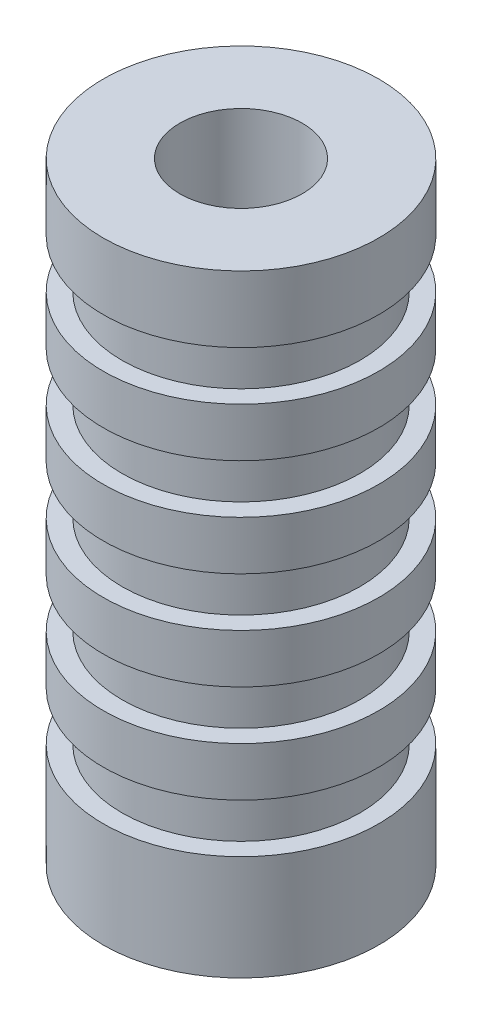
ISO-10303-21;
HEADER;
FILE_DESCRIPTION(('STEP AP214'),'2;1');
FILE_NAME('part.step','',(''),(''),'','','');
FILE_SCHEMA(('AUTOMOTIVE_DESIGN { 1 0 10303 214 1 1 1 1 }'));
ENDSEC;
DATA;
#1=APPLICATION_CONTEXT('core data for automotive mechanical design processes');
#2=APPLICATION_PROTOCOL_DEFINITION('international standard','automotive_design',2000,#1);
#3=PRODUCT_CONTEXT('',#1,'mechanical');
#4=PRODUCT('Part','Part','',(#3));
#5=PRODUCT_RELATED_PRODUCT_CATEGORY('part','',(#4));
#6=PRODUCT_DEFINITION_FORMATION('','',#4);
#7=PRODUCT_DEFINITION_CONTEXT('part definition',#1,'design');
#8=PRODUCT_DEFINITION('design','',#6,#7);
#9=PRODUCT_DEFINITION_SHAPE('','',#8);
#10=(LENGTH_UNIT() NAMED_UNIT(*) SI_UNIT(.MILLI.,.METRE.));
#11=(NAMED_UNIT(*) PLANE_ANGLE_UNIT() SI_UNIT($,.RADIAN.));
#12=(NAMED_UNIT(*) SI_UNIT($,.STERADIAN.) SOLID_ANGLE_UNIT());
#13=UNCERTAINTY_MEASURE_WITH_UNIT(LENGTH_MEASURE(1.E-05),#10,'distance_accuracy_value','');
#14=(GEOMETRIC_REPRESENTATION_CONTEXT(3) GLOBAL_UNCERTAINTY_ASSIGNED_CONTEXT((#13)) GLOBAL_UNIT_ASSIGNED_CONTEXT((#10,
#11,#12)) REPRESENTATION_CONTEXT('',''));
#15=CARTESIAN_POINT('',(0.,0.,0.));
#16=DIRECTION('',(0.,0.,1.));
#17=DIRECTION('',(1.,0.,0.));
#18=AXIS2_PLACEMENT_3D('',#15,#16,#17);
#19=CARTESIAN_POINT('',(0.,25.4,0.));
#20=DIRECTION('',(0.,-1.,0.));
#21=DIRECTION('',(0.,0.,-1.));
#22=AXIS2_PLACEMENT_3D('',#19,#20,#21);
#23=CYLINDRICAL_SURFACE('',#22,5.715);
#24=CARTESIAN_POINT('',(0.,8.42138588701736,0.));
#25=DIRECTION('',(0.,-1.,0.));
#26=DIRECTION('',(0.,0.,-1.));
#27=AXIS2_PLACEMENT_3D('',#24,#25,#26);
#28=CIRCLE('',#27,5.715);
#29=CARTESIAN_POINT('',(0.,8.42138588701736,-5.715));
#30=VERTEX_POINT('',#29);
#31=EDGE_CURVE('E62',#30,#30,#28,.T.);
#32=ORIENTED_EDGE('',*,*,#31,.T.);
#33=EDGE_LOOP('',(#32));
#34=FACE_BOUND('',#33,.T.);
#35=CARTESIAN_POINT('',(0.,6.38938588701736,0.));
#36=DIRECTION('',(0.,-1.,0.));
#37=DIRECTION('',(0.,0.,-1.));
#38=AXIS2_PLACEMENT_3D('',#35,#36,#37);
#39=CIRCLE('',#38,5.715);
#40=CARTESIAN_POINT('',(0.,6.38938588701736,-5.715));
#41=VERTEX_POINT('',#40);
#42=EDGE_CURVE('E53',#41,#41,#39,.T.);
#43=ORIENTED_EDGE('',*,*,#42,.F.);
#44=EDGE_LOOP('',(#43));
#45=FACE_BOUND('',#44,.T.);
#46=ADVANCED_FACE('F32',(#34,#45),#23,.T.);
#47=CARTESIAN_POINT('',(0.,4.35738588701736,0.));
#48=DIRECTION('',(0.,-1.,0.));
#49=DIRECTION('',(0.,0.,-1.));
#50=AXIS2_PLACEMENT_3D('',#47,#48,#49);
#51=CIRCLE('',#50,5.715);
#52=CARTESIAN_POINT('',(0.,4.35738588701736,-5.715));
#53=VERTEX_POINT('',#52);
#54=EDGE_CURVE('E48',#53,#53,#51,.T.);
#55=ORIENTED_EDGE('',*,*,#54,.T.);
#56=EDGE_LOOP('',(#55));
#57=FACE_BOUND('',#56,.T.);
#58=CARTESIAN_POINT('',(0.,0.,0.));
#59=DIRECTION('',(0.,1.,0.));
#60=DIRECTION('',(0.,0.,1.));
#61=AXIS2_PLACEMENT_3D('',#58,#59,#60);
#62=CIRCLE('',#61,5.715);
#63=CARTESIAN_POINT('',(0.,0.,5.715));
#64=VERTEX_POINT('',#63);
#65=EDGE_CURVE('E36',#64,#64,#62,.T.);
#66=ORIENTED_EDGE('',*,*,#65,.T.);
#67=EDGE_LOOP('',(#66));
#68=FACE_BOUND('',#67,.T.);
#69=ADVANCED_FACE('F175',(#57,#68),#23,.T.);
#70=CARTESIAN_POINT('',(0.,25.4,0.));
#71=DIRECTION('',(0.,1.,0.));
#72=DIRECTION('',(0.,0.,1.));
#73=AXIS2_PLACEMENT_3D('',#70,#71,#72);
#74=PLANE('',#73);
#75=CARTESIAN_POINT('',(0.,25.4,0.));
#76=DIRECTION('',(0.,1.,0.));
#77=DIRECTION('',(0.,0.,1.));
#78=AXIS2_PLACEMENT_3D('',#75,#76,#77);
#79=CIRCLE('',#78,5.715);
#80=CARTESIAN_POINT('',(0.,25.4,5.715));
#81=VERTEX_POINT('',#80);
#82=EDGE_CURVE('E10',#81,#81,#79,.T.);
#83=ORIENTED_EDGE('',*,*,#82,.T.);
#84=EDGE_LOOP('',(#83));
#85=FACE_BOUND('',#84,.T.);
#86=CARTESIAN_POINT('',(0.,25.4,0.));
#87=DIRECTION('',(0.,1.,0.));
#88=DIRECTION('',(0.,0.,1.));
#89=AXIS2_PLACEMENT_3D('',#86,#87,#88);
#90=CIRCLE('',#89,2.54);
#91=CARTESIAN_POINT('',(0.,25.4,2.54));
#92=VERTEX_POINT('',#91);
#93=EDGE_CURVE('E43',#92,#92,#90,.T.);
#94=ORIENTED_EDGE('',*,*,#93,.F.);
#95=EDGE_LOOP('',(#94));
#96=FACE_BOUND('',#95,.T.);
#97=ADVANCED_FACE('F207',(#85,#96),#74,.T.);
#98=CARTESIAN_POINT('',(0.,0.,0.));
#99=DIRECTION('',(0.,1.,0.));
#100=DIRECTION('',(0.,0.,1.));
#101=AXIS2_PLACEMENT_3D('',#98,#99,#100);
#102=PLANE('',#101);
#103=ORIENTED_EDGE('',*,*,#65,.F.);
#104=EDGE_LOOP('',(#103));
#105=FACE_BOUND('',#104,.T.);
#106=CARTESIAN_POINT('',(0.,0.,0.));
#107=DIRECTION('',(0.,1.,0.));
#108=DIRECTION('',(0.,0.,1.));
#109=AXIS2_PLACEMENT_3D('',#106,#107,#108);
#110=CIRCLE('',#109,2.54);
#111=CARTESIAN_POINT('',(0.,0.,2.54));
#112=VERTEX_POINT('',#111);
#113=EDGE_CURVE('E45',#112,#112,#110,.T.);
#114=ORIENTED_EDGE('',*,*,#113,.T.);
#115=EDGE_LOOP('',(#114));
#116=FACE_BOUND('',#115,.T.);
#117=ADVANCED_FACE('F199',(#105,#116),#102,.F.);
#118=CARTESIAN_POINT('',(0.,22.6453858870174,0.));
#119=DIRECTION('',(0.,-1.,0.));
#120=DIRECTION('',(0.,0.,-1.));
#121=AXIS2_PLACEMENT_3D('',#118,#119,#120);
#122=CIRCLE('',#121,5.715);
#123=CARTESIAN_POINT('',(0.,22.6453858870174,-5.715));
#124=VERTEX_POINT('',#123);
#125=EDGE_CURVE('E67',#124,#124,#122,.T.);
#126=ORIENTED_EDGE('',*,*,#125,.F.);
#127=EDGE_LOOP('',(#126));
#128=FACE_BOUND('',#127,.T.);
#129=ORIENTED_EDGE('',*,*,#82,.F.);
#130=EDGE_LOOP('',(#129));
#131=FACE_BOUND('',#130,.T.);
#132=ADVANCED_FACE('F34',(#128,#131),#23,.T.);
#133=CARTESIAN_POINT('',(0.,25.4,0.));
#134=DIRECTION('',(0.,-1.,0.));
#135=DIRECTION('',(0.,0.,-1.));
#136=AXIS2_PLACEMENT_3D('',#133,#134,#135);
#137=CYLINDRICAL_SURFACE('',#136,2.54);
#138=ORIENTED_EDGE('',*,*,#93,.T.);
#139=EDGE_LOOP('',(#138));
#140=FACE_BOUND('',#139,.T.);
#141=ORIENTED_EDGE('',*,*,#113,.F.);
#142=EDGE_LOOP('',(#141));
#143=FACE_BOUND('',#142,.T.);
#144=ADVANCED_FACE('F198',(#140,#143),#137,.F.);
#145=CARTESIAN_POINT('',(0.,4.35738588701736,-4.93518326354092));
#146=DIRECTION('',(0.,-1.,0.));
#147=DIRECTION('',(0.,0.,-1.));
#148=AXIS2_PLACEMENT_3D('',#145,#146,#147);
#149=PLANE('',#148);
#150=ORIENTED_EDGE('',*,*,#54,.F.);
#151=EDGE_LOOP('',(#150));
#152=FACE_BOUND('',#151,.T.);
#153=CARTESIAN_POINT('',(0.,4.35738588701736,0.));
#154=DIRECTION('',(0.,-1.,0.));
#155=DIRECTION('',(0.,0.,-1.));
#156=AXIS2_PLACEMENT_3D('',#153,#154,#155);
#157=CIRCLE('',#156,4.93518326354092);
#158=CARTESIAN_POINT('',(0.,4.35738588701736,-4.93518326354092));
#159=VERTEX_POINT('',#158);
#160=EDGE_CURVE('E59',#159,#159,#157,.T.);
#161=ORIENTED_EDGE('',*,*,#160,.T.);
#162=EDGE_LOOP('',(#161));
#163=FACE_BOUND('',#162,.T.);
#164=ADVANCED_FACE('F204',(#152,#163),#149,.F.);
#165=CARTESIAN_POINT('',(0.,6.38938588701736,-5.715));
#166=DIRECTION('',(0.,1.,0.));
#167=DIRECTION('',(0.,0.,1.));
#168=AXIS2_PLACEMENT_3D('',#165,#166,#167);
#169=PLANE('',#168);
#170=CARTESIAN_POINT('',(0.,6.38938588701736,0.));
#171=DIRECTION('',(0.,-1.,0.));
#172=DIRECTION('',(0.,0.,-1.));
#173=AXIS2_PLACEMENT_3D('',#170,#171,#172);
#174=CIRCLE('',#173,4.93518326354092);
#175=CARTESIAN_POINT('',(0.,6.38938588701736,-4.93518326354092));
#176=VERTEX_POINT('',#175);
#177=EDGE_CURVE('E56',#176,#176,#174,.T.);
#178=ORIENTED_EDGE('',*,*,#177,.F.);
#179=EDGE_LOOP('',(#178));
#180=FACE_BOUND('',#179,.T.);
#181=ORIENTED_EDGE('',*,*,#42,.T.);
#182=EDGE_LOOP('',(#181));
#183=FACE_BOUND('',#182,.T.);
#184=ADVANCED_FACE('F226',(#180,#183),#169,.F.);
#185=CARTESIAN_POINT('',(0.,0.,0.));
#186=DIRECTION('',(0.,-1.,0.));
#187=DIRECTION('',(0.,0.,-1.));
#188=AXIS2_PLACEMENT_3D('',#185,#186,#187);
#189=CYLINDRICAL_SURFACE('',#188,4.93518326354092);
#190=ORIENTED_EDGE('',*,*,#160,.F.);
#191=EDGE_LOOP('',(#190));
#192=FACE_BOUND('',#191,.T.);
#193=ORIENTED_EDGE('',*,*,#177,.T.);
#194=EDGE_LOOP('',(#193));
#195=FACE_BOUND('',#194,.T.);
#196=ADVANCED_FACE('F182',(#192,#195),#189,.T.);
#197=CARTESIAN_POINT('',(0.,20.6133858870174,-4.93518326354092));
#198=DIRECTION('',(0.,-1.,0.));
#199=DIRECTION('',(0.,0.,-1.));
#200=AXIS2_PLACEMENT_3D('',#197,#198,#199);
#201=PLANE('',#200);
#202=CARTESIAN_POINT('',(0.,20.6133858870174,0.));
#203=DIRECTION('',(0.,-1.,0.));
#204=DIRECTION('',(0.,0.,-1.));
#205=AXIS2_PLACEMENT_3D('',#202,#203,#204);
#206=CIRCLE('',#205,5.715);
#207=CARTESIAN_POINT('',(0.,20.6133858870174,-5.715));
#208=VERTEX_POINT('',#207);
#209=EDGE_CURVE('E63',#208,#208,#206,.T.);
#210=ORIENTED_EDGE('',*,*,#209,.F.);
#211=EDGE_LOOP('',(#210));
#212=FACE_BOUND('',#211,.T.);
#213=CARTESIAN_POINT('',(0.,20.6133858870174,0.));
#214=DIRECTION('',(0.,-1.,0.));
#215=DIRECTION('',(0.,0.,-1.));
#216=AXIS2_PLACEMENT_3D('',#213,#214,#215);
#217=CIRCLE('',#216,4.93518326354092);
#218=CARTESIAN_POINT('',(0.,20.6133858870174,-4.93518326354092));
#219=VERTEX_POINT('',#218);
#220=EDGE_CURVE('E73',#219,#219,#217,.T.);
#221=ORIENTED_EDGE('',*,*,#220,.T.);
#222=EDGE_LOOP('',(#221));
#223=FACE_BOUND('',#222,.T.);
#224=ADVANCED_FACE('F178',(#212,#223),#201,.F.);
#225=CARTESIAN_POINT('',(0.,22.6453858870174,-5.715));
#226=DIRECTION('',(0.,1.,0.));
#227=DIRECTION('',(0.,0.,1.));
#228=AXIS2_PLACEMENT_3D('',#225,#226,#227);
#229=PLANE('',#228);
#230=CARTESIAN_POINT('',(0.,22.6453858870174,0.));
#231=DIRECTION('',(0.,-1.,0.));
#232=DIRECTION('',(0.,0.,-1.));
#233=AXIS2_PLACEMENT_3D('',#230,#231,#232);
#234=CIRCLE('',#233,4.93518326354092);
#235=CARTESIAN_POINT('',(0.,22.6453858870174,-4.93518326354092));
#236=VERTEX_POINT('',#235);
#237=EDGE_CURVE('E70',#236,#236,#234,.T.);
#238=ORIENTED_EDGE('',*,*,#237,.F.);
#239=EDGE_LOOP('',(#238));
#240=FACE_BOUND('',#239,.T.);
#241=ORIENTED_EDGE('',*,*,#125,.T.);
#242=EDGE_LOOP('',(#241));
#243=FACE_BOUND('',#242,.T.);
#244=ADVANCED_FACE('F181',(#240,#243),#229,.F.);
#245=CARTESIAN_POINT('',(0.,0.,0.));
#246=DIRECTION('',(0.,-1.,0.));
#247=DIRECTION('',(0.,0.,-1.));
#248=AXIS2_PLACEMENT_3D('',#245,#246,#247);
#249=CYLINDRICAL_SURFACE('',#248,4.93518326354092);
#250=ORIENTED_EDGE('',*,*,#220,.F.);
#251=EDGE_LOOP('',(#250));
#252=FACE_BOUND('',#251,.T.);
#253=ORIENTED_EDGE('',*,*,#237,.T.);
#254=EDGE_LOOP('',(#253));
#255=FACE_BOUND('',#254,.T.);
#256=ADVANCED_FACE('F174',(#252,#255),#249,.T.);
#257=CARTESIAN_POINT('',(0.,18.5813858870174,0.));
#258=DIRECTION('',(0.,-1.,0.));
#259=DIRECTION('',(0.,0.,-1.));
#260=AXIS2_PLACEMENT_3D('',#257,#258,#259);
#261=CIRCLE('',#260,5.715);
#262=CARTESIAN_POINT('',(0.,18.5813858870174,-5.715));
#263=VERTEX_POINT('',#262);
#264=EDGE_CURVE('E80',#263,#263,#261,.T.);
#265=ORIENTED_EDGE('',*,*,#264,.F.);
#266=EDGE_LOOP('',(#265));
#267=FACE_BOUND('',#266,.T.);
#268=ORIENTED_EDGE('',*,*,#209,.T.);
#269=EDGE_LOOP('',(#268));
#270=FACE_BOUND('',#269,.T.);
#271=ADVANCED_FACE('F152',(#267,#270),#23,.T.);
#272=CARTESIAN_POINT('',(0.,16.5493858870174,-4.93518326354092));
#273=DIRECTION('',(0.,-1.,0.));
#274=DIRECTION('',(0.,0.,-1.));
#275=AXIS2_PLACEMENT_3D('',#272,#273,#274);
#276=PLANE('',#275);
#277=CARTESIAN_POINT('',(0.,16.5493858870174,0.));
#278=DIRECTION('',(0.,-1.,0.));
#279=DIRECTION('',(0.,0.,-1.));
#280=AXIS2_PLACEMENT_3D('',#277,#278,#279);
#281=CIRCLE('',#280,5.715);
#282=CARTESIAN_POINT('',(0.,16.5493858870174,-5.715));
#283=VERTEX_POINT('',#282);
#284=EDGE_CURVE('E76',#283,#283,#281,.T.);
#285=ORIENTED_EDGE('',*,*,#284,.F.);
#286=EDGE_LOOP('',(#285));
#287=FACE_BOUND('',#286,.T.);
#288=CARTESIAN_POINT('',(0.,16.5493858870174,0.));
#289=DIRECTION('',(0.,-1.,0.));
#290=DIRECTION('',(0.,0.,-1.));
#291=AXIS2_PLACEMENT_3D('',#288,#289,#290);
#292=CIRCLE('',#291,4.93518326354092);
#293=CARTESIAN_POINT('',(0.,16.5493858870174,-4.93518326354092));
#294=VERTEX_POINT('',#293);
#295=EDGE_CURVE('E66',#294,#294,#292,.T.);
#296=ORIENTED_EDGE('',*,*,#295,.T.);
#297=EDGE_LOOP('',(#296));
#298=FACE_BOUND('',#297,.T.);
#299=ADVANCED_FACE('F155',(#287,#298),#276,.F.);
#300=CARTESIAN_POINT('',(0.,18.5813858870174,-5.715));
#301=DIRECTION('',(0.,1.,0.));
#302=DIRECTION('',(0.,0.,1.));
#303=AXIS2_PLACEMENT_3D('',#300,#301,#302);
#304=PLANE('',#303);
#305=CARTESIAN_POINT('',(0.,18.5813858870174,0.));
#306=DIRECTION('',(0.,-1.,0.));
#307=DIRECTION('',(0.,0.,-1.));
#308=AXIS2_PLACEMENT_3D('',#305,#306,#307);
#309=CIRCLE('',#308,4.93518326354092);
#310=CARTESIAN_POINT('',(0.,18.5813858870174,-4.93518326354092));
#311=VERTEX_POINT('',#310);
#312=EDGE_CURVE('E83',#311,#311,#309,.T.);
#313=ORIENTED_EDGE('',*,*,#312,.F.);
#314=EDGE_LOOP('',(#313));
#315=FACE_BOUND('',#314,.T.);
#316=ORIENTED_EDGE('',*,*,#264,.T.);
#317=EDGE_LOOP('',(#316));
#318=FACE_BOUND('',#317,.T.);
#319=ADVANCED_FACE('F158',(#315,#318),#304,.F.);
#320=CARTESIAN_POINT('',(0.,0.,0.));
#321=DIRECTION('',(0.,-1.,0.));
#322=DIRECTION('',(0.,0.,-1.));
#323=AXIS2_PLACEMENT_3D('',#320,#321,#322);
#324=CYLINDRICAL_SURFACE('',#323,4.93518326354092);
#325=ORIENTED_EDGE('',*,*,#295,.F.);
#326=EDGE_LOOP('',(#325));
#327=FACE_BOUND('',#326,.T.);
#328=ORIENTED_EDGE('',*,*,#312,.T.);
#329=EDGE_LOOP('',(#328));
#330=FACE_BOUND('',#329,.T.);
#331=ADVANCED_FACE('F151',(#327,#330),#324,.T.);
#332=CARTESIAN_POINT('',(0.,14.5173858870174,0.));
#333=DIRECTION('',(0.,-1.,0.));
#334=DIRECTION('',(0.,0.,-1.));
#335=AXIS2_PLACEMENT_3D('',#332,#333,#334);
#336=CIRCLE('',#335,5.715);
#337=CARTESIAN_POINT('',(0.,14.5173858870174,-5.715));
#338=VERTEX_POINT('',#337);
#339=EDGE_CURVE('E92',#338,#338,#336,.T.);
#340=ORIENTED_EDGE('',*,*,#339,.F.);
#341=EDGE_LOOP('',(#340));
#342=FACE_BOUND('',#341,.T.);
#343=ORIENTED_EDGE('',*,*,#284,.T.);
#344=EDGE_LOOP('',(#343));
#345=FACE_BOUND('',#344,.T.);
#346=ADVANCED_FACE('F129',(#342,#345),#23,.T.);
#347=CARTESIAN_POINT('',(0.,12.4853858870174,-4.93518326354092));
#348=DIRECTION('',(0.,-1.,0.));
#349=DIRECTION('',(0.,0.,-1.));
#350=AXIS2_PLACEMENT_3D('',#347,#348,#349);
#351=PLANE('',#350);
#352=CARTESIAN_POINT('',(0.,12.4853858870174,0.));
#353=DIRECTION('',(0.,-1.,0.));
#354=DIRECTION('',(0.,0.,-1.));
#355=AXIS2_PLACEMENT_3D('',#352,#353,#354);
#356=CIRCLE('',#355,5.715);
#357=CARTESIAN_POINT('',(0.,12.4853858870174,-5.715));
#358=VERTEX_POINT('',#357);
#359=EDGE_CURVE('E88',#358,#358,#356,.T.);
#360=ORIENTED_EDGE('',*,*,#359,.F.);
#361=EDGE_LOOP('',(#360));
#362=FACE_BOUND('',#361,.T.);
#363=CARTESIAN_POINT('',(0.,12.4853858870174,0.));
#364=DIRECTION('',(0.,-1.,0.));
#365=DIRECTION('',(0.,0.,-1.));
#366=AXIS2_PLACEMENT_3D('',#363,#364,#365);
#367=CIRCLE('',#366,4.93518326354092);
#368=CARTESIAN_POINT('',(0.,12.4853858870174,-4.93518326354092));
#369=VERTEX_POINT('',#368);
#370=EDGE_CURVE('E79',#369,#369,#367,.T.);
#371=ORIENTED_EDGE('',*,*,#370,.T.);
#372=EDGE_LOOP('',(#371));
#373=FACE_BOUND('',#372,.T.);
#374=ADVANCED_FACE('F132',(#362,#373),#351,.F.);
#375=CARTESIAN_POINT('',(0.,14.5173858870174,-5.715));
#376=DIRECTION('',(0.,1.,0.));
#377=DIRECTION('',(0.,0.,1.));
#378=AXIS2_PLACEMENT_3D('',#375,#376,#377);
#379=PLANE('',#378);
#380=CARTESIAN_POINT('',(0.,14.5173858870174,0.));
#381=DIRECTION('',(0.,-1.,0.));
#382=DIRECTION('',(0.,0.,-1.));
#383=AXIS2_PLACEMENT_3D('',#380,#381,#382);
#384=CIRCLE('',#383,4.93518326354092);
#385=CARTESIAN_POINT('',(0.,14.5173858870174,-4.93518326354092));
#386=VERTEX_POINT('',#385);
#387=EDGE_CURVE('E95',#386,#386,#384,.T.);
#388=ORIENTED_EDGE('',*,*,#387,.F.);
#389=EDGE_LOOP('',(#388));
#390=FACE_BOUND('',#389,.T.);
#391=ORIENTED_EDGE('',*,*,#339,.T.);
#392=EDGE_LOOP('',(#391));
#393=FACE_BOUND('',#392,.T.);
#394=ADVANCED_FACE('F135',(#390,#393),#379,.F.);
#395=CARTESIAN_POINT('',(0.,0.,0.));
#396=DIRECTION('',(0.,-1.,0.));
#397=DIRECTION('',(0.,0.,-1.));
#398=AXIS2_PLACEMENT_3D('',#395,#396,#397);
#399=CYLINDRICAL_SURFACE('',#398,4.93518326354092);
#400=ORIENTED_EDGE('',*,*,#370,.F.);
#401=EDGE_LOOP('',(#400));
#402=FACE_BOUND('',#401,.T.);
#403=ORIENTED_EDGE('',*,*,#387,.T.);
#404=EDGE_LOOP('',(#403));
#405=FACE_BOUND('',#404,.T.);
#406=ADVANCED_FACE('F128',(#402,#405),#399,.T.);
#407=CARTESIAN_POINT('',(0.,10.4533858870174,0.));
#408=DIRECTION('',(0.,-1.,0.));
#409=DIRECTION('',(0.,0.,-1.));
#410=AXIS2_PLACEMENT_3D('',#407,#408,#409);
#411=CIRCLE('',#410,5.715);
#412=CARTESIAN_POINT('',(0.,10.4533858870174,-5.715));
#413=VERTEX_POINT('',#412);
#414=EDGE_CURVE('E102',#413,#413,#411,.T.);
#415=ORIENTED_EDGE('',*,*,#414,.F.);
#416=EDGE_LOOP('',(#415));
#417=FACE_BOUND('',#416,.T.);
#418=ORIENTED_EDGE('',*,*,#359,.T.);
#419=EDGE_LOOP('',(#418));
#420=FACE_BOUND('',#419,.T.);
#421=ADVANCED_FACE('F125',(#417,#420),#23,.T.);
#422=CARTESIAN_POINT('',(0.,8.42138588701736,-4.93518326354092));
#423=DIRECTION('',(0.,-1.,0.));
#424=DIRECTION('',(0.,0.,-1.));
#425=AXIS2_PLACEMENT_3D('',#422,#423,#424);
#426=PLANE('',#425);
#427=ORIENTED_EDGE('',*,*,#31,.F.);
#428=EDGE_LOOP('',(#427));
#429=FACE_BOUND('',#428,.T.);
#430=CARTESIAN_POINT('',(0.,8.42138588701736,0.));
#431=DIRECTION('',(0.,-1.,0.));
#432=DIRECTION('',(0.,0.,-1.));
#433=AXIS2_PLACEMENT_3D('',#430,#431,#432);
#434=CIRCLE('',#433,4.93518326354092);
#435=CARTESIAN_POINT('',(0.,8.42138588701736,-4.93518326354092));
#436=VERTEX_POINT('',#435);
#437=EDGE_CURVE('E91',#436,#436,#434,.T.);
#438=ORIENTED_EDGE('',*,*,#437,.T.);
#439=EDGE_LOOP('',(#438));
#440=FACE_BOUND('',#439,.T.);
#441=ADVANCED_FACE('F111',(#429,#440),#426,.F.);
#442=CARTESIAN_POINT('',(0.,10.4533858870174,-5.715));
#443=DIRECTION('',(0.,1.,0.));
#444=DIRECTION('',(0.,0.,1.));
#445=AXIS2_PLACEMENT_3D('',#442,#443,#444);
#446=PLANE('',#445);
#447=CARTESIAN_POINT('',(0.,10.4533858870174,0.));
#448=DIRECTION('',(0.,-1.,0.));
#449=DIRECTION('',(0.,0.,-1.));
#450=AXIS2_PLACEMENT_3D('',#447,#448,#449);
#451=CIRCLE('',#450,4.93518326354092);
#452=CARTESIAN_POINT('',(0.,10.4533858870174,-4.93518326354092));
#453=VERTEX_POINT('',#452);
#454=EDGE_CURVE('E105',#453,#453,#451,.T.);
#455=ORIENTED_EDGE('',*,*,#454,.F.);
#456=EDGE_LOOP('',(#455));
#457=FACE_BOUND('',#456,.T.);
#458=ORIENTED_EDGE('',*,*,#414,.T.);
#459=EDGE_LOOP('',(#458));
#460=FACE_BOUND('',#459,.T.);
#461=ADVANCED_FACE('F116',(#457,#460),#446,.F.);
#462=CARTESIAN_POINT('',(0.,0.,0.));
#463=DIRECTION('',(0.,-1.,0.));
#464=DIRECTION('',(0.,0.,-1.));
#465=AXIS2_PLACEMENT_3D('',#462,#463,#464);
#466=CYLINDRICAL_SURFACE('',#465,4.93518326354092);
#467=ORIENTED_EDGE('',*,*,#437,.F.);
#468=EDGE_LOOP('',(#467));
#469=FACE_BOUND('',#468,.T.);
#470=ORIENTED_EDGE('',*,*,#454,.T.);
#471=EDGE_LOOP('',(#470));
#472=FACE_BOUND('',#471,.T.);
#473=ADVANCED_FACE('F113',(#469,#472),#466,.T.);
#474=CLOSED_SHELL('',(#46,#69,#97,#117,#132,#144,#164,#184,#196,#224,#244,#256,#271,#299,#319,
#331,#346,#374,#394,#406,#421,#441,#461,#473));
#475=MANIFOLD_SOLID_BREP('B2',#474);
#476=ADVANCED_BREP_SHAPE_REPRESENTATION('',(#18,#475),#14);
#477=SHAPE_DEFINITION_REPRESENTATION(#9,#476);
ENDSEC;
END-ISO-10303-21;
